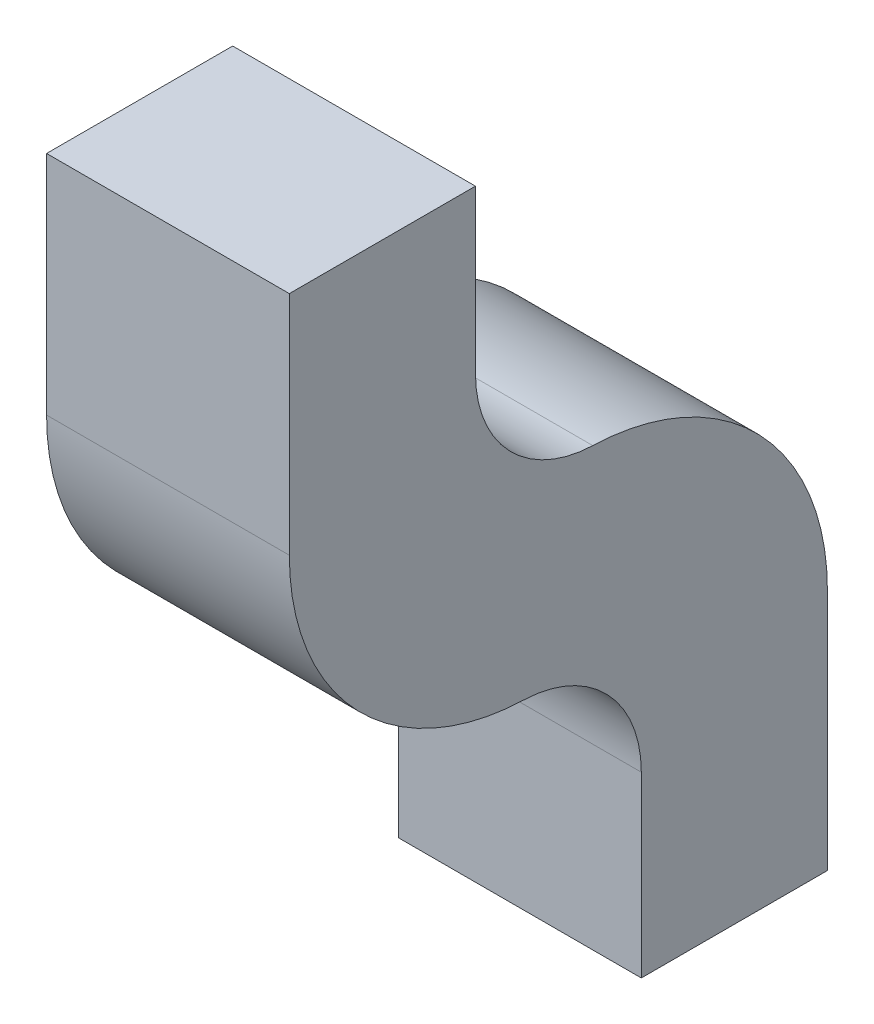
ISO-10303-21;
HEADER;
FILE_DESCRIPTION(('STEP AP214'),'2;1');
FILE_NAME('part.step','',(''),(''),'','','');
FILE_SCHEMA(('AUTOMOTIVE_DESIGN { 1 0 10303 214 1 1 1 1 }'));
ENDSEC;
DATA;
#1=APPLICATION_CONTEXT('core data for automotive mechanical design processes');
#2=APPLICATION_PROTOCOL_DEFINITION('international standard','automotive_design',2000,#1);
#3=PRODUCT_CONTEXT('',#1,'mechanical');
#4=PRODUCT('Part','Part','',(#3));
#5=PRODUCT_RELATED_PRODUCT_CATEGORY('part','',(#4));
#6=PRODUCT_DEFINITION_FORMATION('','',#4);
#7=PRODUCT_DEFINITION_CONTEXT('part definition',#1,'design');
#8=PRODUCT_DEFINITION('design','',#6,#7);
#9=PRODUCT_DEFINITION_SHAPE('','',#8);
#10=(LENGTH_UNIT() NAMED_UNIT(*) SI_UNIT(.MILLI.,.METRE.));
#11=(NAMED_UNIT(*) PLANE_ANGLE_UNIT() SI_UNIT($,.RADIAN.));
#12=(NAMED_UNIT(*) SI_UNIT($,.STERADIAN.) SOLID_ANGLE_UNIT());
#13=UNCERTAINTY_MEASURE_WITH_UNIT(LENGTH_MEASURE(1.E-05),#10,'distance_accuracy_value','');
#14=(GEOMETRIC_REPRESENTATION_CONTEXT(3) GLOBAL_UNCERTAINTY_ASSIGNED_CONTEXT((#13)) GLOBAL_UNIT_ASSIGNED_CONTEXT((#10,
#11,#12)) REPRESENTATION_CONTEXT('',''));
#15=CARTESIAN_POINT('',(0.,0.,0.));
#16=DIRECTION('',(0.,0.,1.));
#17=DIRECTION('',(1.,0.,0.));
#18=AXIS2_PLACEMENT_3D('',#15,#16,#17);
#19=CARTESIAN_POINT('',(2.125,-2.675,0.3325));
#20=DIRECTION('',(1.,0.,0.));
#21=DIRECTION('',(0.,0.,-1.));
#22=AXIS2_PLACEMENT_3D('',#19,#20,#21);
#23=PLANE('',#22);
#24=CARTESIAN_POINT('',(2.125,-2.92974993051695,0.38));
#25=DIRECTION('',(1.,0.,0.));
#26=DIRECTION('',(0.,0.,-1.));
#27=AXIS2_PLACEMENT_3D('',#24,#25,#26);
#28=CIRCLE('',#27,0.15);
#29=CARTESIAN_POINT('',(2.125,-2.92974993051695,0.23));
#30=VERTEX_POINT('',#29);
#31=CARTESIAN_POINT('',(2.125,-2.7798332870113,0.375));
#32=VERTEX_POINT('',#31);
#33=EDGE_CURVE('E102',#30,#32,#28,.T.);
#34=ORIENTED_EDGE('',*,*,#33,.T.);
#35=CARTESIAN_POINT('',(2.125,-2.48,0.365));
#36=DIRECTION('',(1.,0.,0.));
#37=DIRECTION('',(0.,0.,-1.));
#38=AXIS2_PLACEMENT_3D('',#35,#36,#37);
#39=CIRCLE('',#38,0.3);
#40=CARTESIAN_POINT('',(2.125,-2.48,0.665));
#41=VERTEX_POINT('',#40);
#42=EDGE_CURVE('E20',#41,#32,#39,.T.);
#43=ORIENTED_EDGE('',*,*,#42,.F.);
#44=DIRECTION('',(0.,1.,0.));
#45=VECTOR('',#44,1.);
#46=CARTESIAN_POINT('',(2.125,-2.49,0.665));
#47=LINE('',#46,#45);
#48=CARTESIAN_POINT('',(2.125,-2.2,0.665));
#49=VERTEX_POINT('',#48);
#50=EDGE_CURVE('E100',#49,#41,#47,.F.);
#51=ORIENTED_EDGE('',*,*,#50,.F.);
#52=DIRECTION('',(0.,0.,1.));
#53=VECTOR('',#52,1.);
#54=CARTESIAN_POINT('',(2.125,-2.2,0.55));
#55=LINE('',#54,#53);
#56=CARTESIAN_POINT('',(2.125,-2.2,0.435));
#57=VERTEX_POINT('',#56);
#58=EDGE_CURVE('E127',#57,#49,#55,.T.);
#59=ORIENTED_EDGE('',*,*,#58,.F.);
#60=DIRECTION('',(0.,1.,0.));
#61=VECTOR('',#60,1.);
#62=CARTESIAN_POINT('',(2.125,-2.375,0.435));
#63=LINE('',#62,#61);
#64=CARTESIAN_POINT('',(2.125,-2.40025006948305,0.435));
#65=VERTEX_POINT('',#64);
#66=EDGE_CURVE('E120',#65,#57,#63,.T.);
#67=ORIENTED_EDGE('',*,*,#66,.F.);
#68=CARTESIAN_POINT('',(2.125,-2.40025006948305,0.285));
#69=DIRECTION('',(1.,0.,0.));
#70=DIRECTION('',(0.,0.,-1.));
#71=AXIS2_PLACEMENT_3D('',#68,#69,#70);
#72=CIRCLE('',#71,0.15);
#73=CARTESIAN_POINT('',(2.125,-2.5501667129887,0.29));
#74=VERTEX_POINT('',#73);
#75=EDGE_CURVE('E162',#65,#74,#72,.T.);
#76=ORIENTED_EDGE('',*,*,#75,.T.);
#77=CARTESIAN_POINT('',(2.125,-2.85,0.3));
#78=DIRECTION('',(1.,0.,0.));
#79=DIRECTION('',(0.,0.,-1.));
#80=AXIS2_PLACEMENT_3D('',#77,#78,#79);
#81=CIRCLE('',#80,0.3);
#82=CARTESIAN_POINT('',(2.125,-2.85,0.));
#83=VERTEX_POINT('',#82);
#84=EDGE_CURVE('E166',#83,#74,#81,.T.);
#85=ORIENTED_EDGE('',*,*,#84,.F.);
#86=DIRECTION('',(0.,1.,0.));
#87=VECTOR('',#86,1.);
#88=CARTESIAN_POINT('',(2.125,-2.85,0.));
#89=LINE('',#88,#87);
#90=CARTESIAN_POINT('',(2.125,-3.15,0.));
#91=VERTEX_POINT('',#90);
#92=EDGE_CURVE('E136',#91,#83,#89,.T.);
#93=ORIENTED_EDGE('',*,*,#92,.F.);
#94=DIRECTION('',(0.,0.,-1.));
#95=VECTOR('',#94,1.);
#96=CARTESIAN_POINT('',(2.125,-3.15,0.115));
#97=LINE('',#96,#95);
#98=CARTESIAN_POINT('',(2.125,-3.15,0.23));
#99=VERTEX_POINT('',#98);
#100=EDGE_CURVE('E140',#99,#91,#97,.T.);
#101=ORIENTED_EDGE('',*,*,#100,.F.);
#102=DIRECTION('',(0.,-1.,0.));
#103=VECTOR('',#102,1.);
#104=CARTESIAN_POINT('',(2.125,-2.965,0.23));
#105=LINE('',#104,#103);
#106=EDGE_CURVE('E104',#30,#99,#105,.T.);
#107=ORIENTED_EDGE('',*,*,#106,.F.);
#108=EDGE_LOOP('',(#34,#43,#51,#59,#67,#76,#85,#93,#101,#107));
#109=FACE_BOUND('',#108,.T.);
#110=ADVANCED_FACE('F17',(#109),#23,.F.);
#111=CARTESIAN_POINT('',(2.125,-2.49,0.665));
#112=DIRECTION('',(0.,0.,1.));
#113=DIRECTION('',(1.,0.,0.));
#114=AXIS2_PLACEMENT_3D('',#111,#112,#113);
#115=PLANE('',#114);
#116=DIRECTION('',(0.,1.,0.));
#117=VECTOR('',#116,1.);
#118=CARTESIAN_POINT('',(2.425,-2.675,0.665));
#119=LINE('',#118,#117);
#120=CARTESIAN_POINT('',(2.425,-2.2,0.665));
#121=VERTEX_POINT('',#120);
#122=CARTESIAN_POINT('',(2.425,-2.48,0.665));
#123=VERTEX_POINT('',#122);
#124=EDGE_CURVE('E130',#121,#123,#119,.F.);
#125=ORIENTED_EDGE('',*,*,#124,.F.);
#126=DIRECTION('',(1.,0.,0.));
#127=VECTOR('',#126,1.);
#128=CARTESIAN_POINT('',(2.125,-2.2,0.665));
#129=LINE('',#128,#127);
#130=EDGE_CURVE('E117',#49,#121,#129,.T.);
#131=ORIENTED_EDGE('',*,*,#130,.F.);
#132=ORIENTED_EDGE('',*,*,#50,.T.);
#133=DIRECTION('',(1.,0.,0.));
#134=VECTOR('',#133,1.);
#135=CARTESIAN_POINT('',(2.125,-2.48,0.665));
#136=LINE('',#135,#134);
#137=EDGE_CURVE('E99',#123,#41,#136,.F.);
#138=ORIENTED_EDGE('',*,*,#137,.F.);
#139=EDGE_LOOP('',(#125,#131,#132,#138));
#140=FACE_BOUND('',#139,.T.);
#141=ADVANCED_FACE('F231',(#140),#115,.T.);
#142=CARTESIAN_POINT('',(2.125,-2.48,0.365));
#143=DIRECTION('',(1.,0.,0.));
#144=DIRECTION('',(0.,0.,-1.));
#145=AXIS2_PLACEMENT_3D('',#142,#143,#144);
#146=CYLINDRICAL_SURFACE('',#145,0.3);
#147=CARTESIAN_POINT('',(2.425,-2.48,0.365));
#148=DIRECTION('',(1.,0.,0.));
#149=DIRECTION('',(0.,0.,-1.));
#150=AXIS2_PLACEMENT_3D('',#147,#148,#149);
#151=CIRCLE('',#150,0.3);
#152=CARTESIAN_POINT('',(2.425,-2.7798332870113,0.375));
#153=VERTEX_POINT('',#152);
#154=EDGE_CURVE('E160',#123,#153,#151,.T.);
#155=ORIENTED_EDGE('',*,*,#154,.F.);
#156=ORIENTED_EDGE('',*,*,#137,.T.);
#157=ORIENTED_EDGE('',*,*,#42,.T.);
#158=DIRECTION('',(1.,0.,0.));
#159=VECTOR('',#158,1.);
#160=CARTESIAN_POINT('',(2.125,-2.7798332870113,0.375));
#161=LINE('',#160,#159);
#162=EDGE_CURVE('E97',#32,#153,#161,.T.);
#163=ORIENTED_EDGE('',*,*,#162,.T.);
#164=EDGE_LOOP('',(#155,#156,#157,#163));
#165=FACE_BOUND('',#164,.T.);
#166=ADVANCED_FACE('F95',(#165),#146,.T.);
#167=CARTESIAN_POINT('',(2.125,-2.92974993051695,0.38));
#168=DIRECTION('',(1.,0.,0.));
#169=DIRECTION('',(0.,0.,-1.));
#170=AXIS2_PLACEMENT_3D('',#167,#168,#169);
#171=CYLINDRICAL_SURFACE('',#170,0.15);
#172=DIRECTION('',(1.,0.,0.));
#173=VECTOR('',#172,1.);
#174=CARTESIAN_POINT('',(2.125,-2.92974993051695,0.23));
#175=LINE('',#174,#173);
#176=CARTESIAN_POINT('',(2.425,-2.92974993051695,0.23));
#177=VERTEX_POINT('',#176);
#178=EDGE_CURVE('E107',#177,#30,#175,.F.);
#179=ORIENTED_EDGE('',*,*,#178,.F.);
#180=CARTESIAN_POINT('',(2.425,-2.92974993051695,0.38));
#181=DIRECTION('',(1.,0.,0.));
#182=DIRECTION('',(0.,0.,-1.));
#183=AXIS2_PLACEMENT_3D('',#180,#181,#182);
#184=CIRCLE('',#183,0.15);
#185=EDGE_CURVE('E110',#153,#177,#184,.F.);
#186=ORIENTED_EDGE('',*,*,#185,.F.);
#187=ORIENTED_EDGE('',*,*,#162,.F.);
#188=ORIENTED_EDGE('',*,*,#33,.F.);
#189=EDGE_LOOP('',(#179,#186,#187,#188));
#190=FACE_BOUND('',#189,.T.);
#191=ADVANCED_FACE('F108',(#190),#171,.F.);
#192=CARTESIAN_POINT('',(2.125,-2.965,0.23));
#193=DIRECTION('',(0.,0.,1.));
#194=DIRECTION('',(0.,-1.,0.));
#195=AXIS2_PLACEMENT_3D('',#192,#193,#194);
#196=PLANE('',#195);
#197=ORIENTED_EDGE('',*,*,#106,.T.);
#198=DIRECTION('',(1.,0.,0.));
#199=VECTOR('',#198,1.);
#200=CARTESIAN_POINT('',(2.125,-3.15,0.23));
#201=LINE('',#200,#199);
#202=CARTESIAN_POINT('',(2.425,-3.15,0.23));
#203=VERTEX_POINT('',#202);
#204=EDGE_CURVE('E145',#203,#99,#201,.F.);
#205=ORIENTED_EDGE('',*,*,#204,.F.);
#206=DIRECTION('',(0.,1.,0.));
#207=VECTOR('',#206,1.);
#208=CARTESIAN_POINT('',(2.425,-2.675,0.23));
#209=LINE('',#208,#207);
#210=EDGE_CURVE('E159',#177,#203,#209,.F.);
#211=ORIENTED_EDGE('',*,*,#210,.F.);
#212=ORIENTED_EDGE('',*,*,#178,.T.);
#213=EDGE_LOOP('',(#197,#205,#211,#212));
#214=FACE_BOUND('',#213,.T.);
#215=ADVANCED_FACE('F192',(#214),#196,.T.);
#216=CARTESIAN_POINT('',(2.125,-3.15,0.115));
#217=DIRECTION('',(0.,-1.,0.));
#218=DIRECTION('',(0.,0.,-1.));
#219=AXIS2_PLACEMENT_3D('',#216,#217,#218);
#220=PLANE('',#219);
#221=ORIENTED_EDGE('',*,*,#204,.T.);
#222=ORIENTED_EDGE('',*,*,#100,.T.);
#223=DIRECTION('',(-1.,0.,0.));
#224=VECTOR('',#223,1.);
#225=CARTESIAN_POINT('',(2.125,-3.15,0.));
#226=LINE('',#225,#224);
#227=CARTESIAN_POINT('',(2.425,-3.15,0.));
#228=VERTEX_POINT('',#227);
#229=EDGE_CURVE('E139',#228,#91,#226,.T.);
#230=ORIENTED_EDGE('',*,*,#229,.F.);
#231=DIRECTION('',(0.,0.,-1.));
#232=VECTOR('',#231,1.);
#233=CARTESIAN_POINT('',(2.425,-3.15,0.3325));
#234=LINE('',#233,#232);
#235=EDGE_CURVE('E179',#203,#228,#234,.T.);
#236=ORIENTED_EDGE('',*,*,#235,.F.);
#237=EDGE_LOOP('',(#221,#222,#230,#236));
#238=FACE_BOUND('',#237,.T.);
#239=ADVANCED_FACE('F188',(#238),#220,.T.);
#240=CARTESIAN_POINT('',(2.125,-2.85,0.));
#241=DIRECTION('',(0.,0.,-1.));
#242=DIRECTION('',(-1.,0.,0.));
#243=AXIS2_PLACEMENT_3D('',#240,#241,#242);
#244=PLANE('',#243);
#245=DIRECTION('',(0.,1.,0.));
#246=VECTOR('',#245,1.);
#247=CARTESIAN_POINT('',(2.425,-2.675,0.));
#248=LINE('',#247,#246);
#249=CARTESIAN_POINT('',(2.425,-2.85,0.));
#250=VERTEX_POINT('',#249);
#251=EDGE_CURVE('E157',#228,#250,#248,.T.);
#252=ORIENTED_EDGE('',*,*,#251,.F.);
#253=ORIENTED_EDGE('',*,*,#229,.T.);
#254=ORIENTED_EDGE('',*,*,#92,.T.);
#255=DIRECTION('',(1.,0.,0.));
#256=VECTOR('',#255,1.);
#257=CARTESIAN_POINT('',(2.125,-2.85,0.));
#258=LINE('',#257,#256);
#259=EDGE_CURVE('E167',#250,#83,#258,.F.);
#260=ORIENTED_EDGE('',*,*,#259,.F.);
#261=EDGE_LOOP('',(#252,#253,#254,#260));
#262=FACE_BOUND('',#261,.T.);
#263=ADVANCED_FACE('F193',(#262),#244,.T.);
#264=CARTESIAN_POINT('',(2.125,-2.85,0.3));
#265=DIRECTION('',(1.,0.,0.));
#266=DIRECTION('',(0.,0.,-1.));
#267=AXIS2_PLACEMENT_3D('',#264,#265,#266);
#268=CYLINDRICAL_SURFACE('',#267,0.3);
#269=CARTESIAN_POINT('',(2.425,-2.85,0.3));
#270=DIRECTION('',(1.,0.,0.));
#271=DIRECTION('',(0.,0.,-1.));
#272=AXIS2_PLACEMENT_3D('',#269,#270,#271);
#273=CIRCLE('',#272,0.3);
#274=CARTESIAN_POINT('',(2.425,-2.5501667129887,0.29));
#275=VERTEX_POINT('',#274);
#276=EDGE_CURVE('E154',#250,#275,#273,.T.);
#277=ORIENTED_EDGE('',*,*,#276,.F.);
#278=ORIENTED_EDGE('',*,*,#259,.T.);
#279=ORIENTED_EDGE('',*,*,#84,.T.);
#280=DIRECTION('',(1.,0.,0.));
#281=VECTOR('',#280,1.);
#282=CARTESIAN_POINT('',(2.125,-2.5501667129887,0.29));
#283=LINE('',#282,#281);
#284=EDGE_CURVE('E165',#74,#275,#283,.T.);
#285=ORIENTED_EDGE('',*,*,#284,.T.);
#286=EDGE_LOOP('',(#277,#278,#279,#285));
#287=FACE_BOUND('',#286,.T.);
#288=ADVANCED_FACE('F195',(#287),#268,.T.);
#289=CARTESIAN_POINT('',(2.125,-2.40025006948305,0.285));
#290=DIRECTION('',(1.,0.,0.));
#291=DIRECTION('',(0.,0.,-1.));
#292=AXIS2_PLACEMENT_3D('',#289,#290,#291);
#293=CYLINDRICAL_SURFACE('',#292,0.15);
#294=DIRECTION('',(-1.,0.,0.));
#295=VECTOR('',#294,1.);
#296=CARTESIAN_POINT('',(2.125,-2.40025006948305,0.435));
#297=LINE('',#296,#295);
#298=CARTESIAN_POINT('',(2.425,-2.40025006948305,0.435));
#299=VERTEX_POINT('',#298);
#300=EDGE_CURVE('E124',#299,#65,#297,.T.);
#301=ORIENTED_EDGE('',*,*,#300,.F.);
#302=CARTESIAN_POINT('',(2.425,-2.40025006948305,0.285));
#303=DIRECTION('',(1.,0.,0.));
#304=DIRECTION('',(0.,0.,-1.));
#305=AXIS2_PLACEMENT_3D('',#302,#303,#304);
#306=CIRCLE('',#305,0.15);
#307=EDGE_CURVE('E151',#275,#299,#306,.F.);
#308=ORIENTED_EDGE('',*,*,#307,.F.);
#309=ORIENTED_EDGE('',*,*,#284,.F.);
#310=ORIENTED_EDGE('',*,*,#75,.F.);
#311=EDGE_LOOP('',(#301,#308,#309,#310));
#312=FACE_BOUND('',#311,.T.);
#313=ADVANCED_FACE('F229',(#312),#293,.F.);
#314=CARTESIAN_POINT('',(2.125,-2.375,0.435));
#315=DIRECTION('',(0.,0.,-1.));
#316=DIRECTION('',(-1.,0.,0.));
#317=AXIS2_PLACEMENT_3D('',#314,#315,#316);
#318=PLANE('',#317);
#319=ORIENTED_EDGE('',*,*,#66,.T.);
#320=DIRECTION('',(1.,0.,0.));
#321=VECTOR('',#320,1.);
#322=CARTESIAN_POINT('',(2.125,-2.2,0.435));
#323=LINE('',#322,#321);
#324=CARTESIAN_POINT('',(2.425,-2.2,0.435));
#325=VERTEX_POINT('',#324);
#326=EDGE_CURVE('E35',#325,#57,#323,.F.);
#327=ORIENTED_EDGE('',*,*,#326,.F.);
#328=DIRECTION('',(0.,1.,0.));
#329=VECTOR('',#328,1.);
#330=CARTESIAN_POINT('',(2.425,-2.675,0.435));
#331=LINE('',#330,#329);
#332=EDGE_CURVE('E26',#299,#325,#331,.T.);
#333=ORIENTED_EDGE('',*,*,#332,.F.);
#334=ORIENTED_EDGE('',*,*,#300,.T.);
#335=EDGE_LOOP('',(#319,#327,#333,#334));
#336=FACE_BOUND('',#335,.T.);
#337=ADVANCED_FACE('F226',(#336),#318,.T.);
#338=CARTESIAN_POINT('',(2.125,-2.2,0.55));
#339=DIRECTION('',(0.,1.,0.));
#340=DIRECTION('',(0.,0.,1.));
#341=AXIS2_PLACEMENT_3D('',#338,#339,#340);
#342=PLANE('',#341);
#343=ORIENTED_EDGE('',*,*,#326,.T.);
#344=ORIENTED_EDGE('',*,*,#58,.T.);
#345=ORIENTED_EDGE('',*,*,#130,.T.);
#346=DIRECTION('',(0.,0.,-1.));
#347=VECTOR('',#346,1.);
#348=CARTESIAN_POINT('',(2.425,-2.2,0.3325));
#349=LINE('',#348,#347);
#350=EDGE_CURVE('E11',#325,#121,#349,.F.);
#351=ORIENTED_EDGE('',*,*,#350,.F.);
#352=EDGE_LOOP('',(#343,#344,#345,#351));
#353=FACE_BOUND('',#352,.T.);
#354=ADVANCED_FACE('F223',(#353),#342,.T.);
#355=CARTESIAN_POINT('',(2.425,-2.675,0.3325));
#356=DIRECTION('',(1.,0.,0.));
#357=DIRECTION('',(0.,0.,-1.));
#358=AXIS2_PLACEMENT_3D('',#355,#356,#357);
#359=PLANE('',#358);
#360=ORIENTED_EDGE('',*,*,#332,.T.);
#361=ORIENTED_EDGE('',*,*,#350,.T.);
#362=ORIENTED_EDGE('',*,*,#124,.T.);
#363=ORIENTED_EDGE('',*,*,#154,.T.);
#364=ORIENTED_EDGE('',*,*,#185,.T.);
#365=ORIENTED_EDGE('',*,*,#210,.T.);
#366=ORIENTED_EDGE('',*,*,#235,.T.);
#367=ORIENTED_EDGE('',*,*,#251,.T.);
#368=ORIENTED_EDGE('',*,*,#276,.T.);
#369=ORIENTED_EDGE('',*,*,#307,.T.);
#370=EDGE_LOOP('',(#360,#361,#362,#363,#364,#365,#366,#367,#368,#369));
#371=FACE_BOUND('',#370,.T.);
#372=ADVANCED_FACE('F201',(#371),#359,.T.);
#373=CLOSED_SHELL('',(#110,#141,#166,#191,#215,#239,#263,#288,#313,#337,#354,#372));
#374=MANIFOLD_SOLID_BREP('B1',#373);
#375=ADVANCED_BREP_SHAPE_REPRESENTATION('',(#18,#374),#14);
#376=SHAPE_DEFINITION_REPRESENTATION(#9,#375);
ENDSEC;
END-ISO-10303-21;
